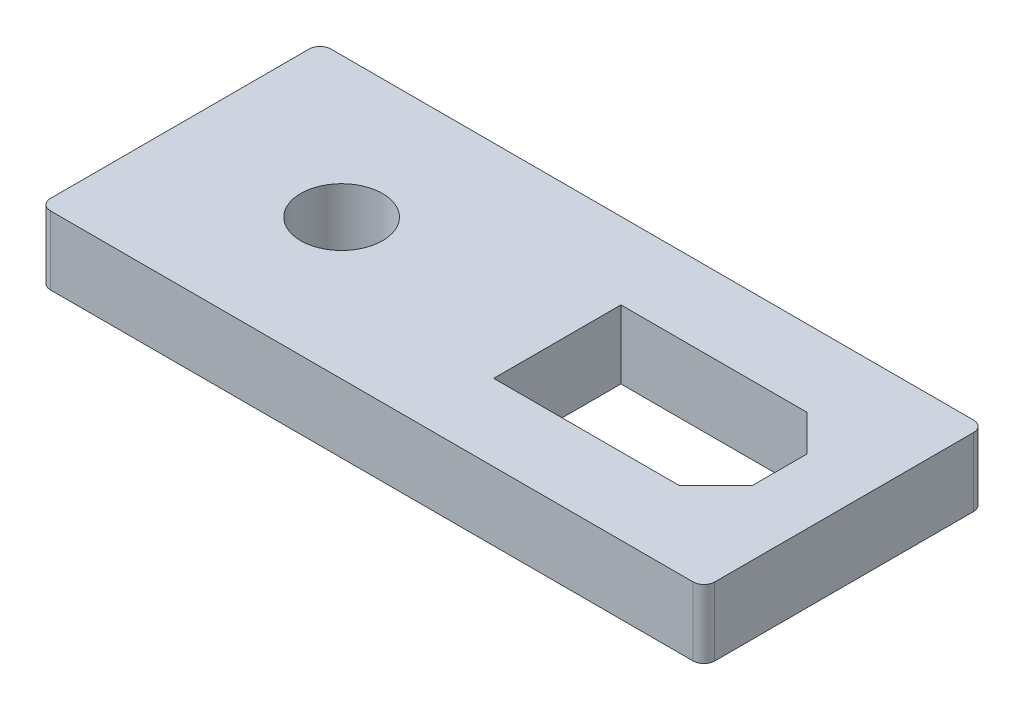
ISO-10303-21;
HEADER;
FILE_DESCRIPTION(('STEP AP214'),'2;1');
FILE_NAME('part.step','',(''),(''),'','','');
FILE_SCHEMA(('AUTOMOTIVE_DESIGN { 1 0 10303 214 1 1 1 1 }'));
ENDSEC;
DATA;
#1=APPLICATION_CONTEXT('core data for automotive mechanical design processes');
#2=APPLICATION_PROTOCOL_DEFINITION('international standard','automotive_design',2000,#1);
#3=PRODUCT_CONTEXT('',#1,'mechanical');
#4=PRODUCT('Part','Part','',(#3));
#5=PRODUCT_RELATED_PRODUCT_CATEGORY('part','',(#4));
#6=PRODUCT_DEFINITION_FORMATION('','',#4);
#7=PRODUCT_DEFINITION_CONTEXT('part definition',#1,'design');
#8=PRODUCT_DEFINITION('design','',#6,#7);
#9=PRODUCT_DEFINITION_SHAPE('','',#8);
#10=(LENGTH_UNIT() NAMED_UNIT(*) SI_UNIT(.MILLI.,.METRE.));
#11=(NAMED_UNIT(*) PLANE_ANGLE_UNIT() SI_UNIT($,.RADIAN.));
#12=(NAMED_UNIT(*) SI_UNIT($,.STERADIAN.) SOLID_ANGLE_UNIT());
#13=UNCERTAINTY_MEASURE_WITH_UNIT(LENGTH_MEASURE(1.E-05),#10,'distance_accuracy_value','');
#14=(GEOMETRIC_REPRESENTATION_CONTEXT(3) GLOBAL_UNCERTAINTY_ASSIGNED_CONTEXT((#13)) GLOBAL_UNIT_ASSIGNED_CONTEXT((#10,
#11,#12)) REPRESENTATION_CONTEXT('',''));
#15=CARTESIAN_POINT('',(0.,0.,0.));
#16=DIRECTION('',(0.,0.,1.));
#17=DIRECTION('',(1.,0.,0.));
#18=AXIS2_PLACEMENT_3D('',#15,#16,#17);
#19=CARTESIAN_POINT('',(0.,3.175,0.));
#20=DIRECTION('',(0.,-1.,0.));
#21=DIRECTION('',(0.,0.,-1.));
#22=AXIS2_PLACEMENT_3D('',#19,#20,#21);
#23=PLANE('',#22);
#24=CARTESIAN_POINT('',(7.5,3.175,-6.5));
#25=DIRECTION('',(0.,1.,0.));
#26=DIRECTION('',(0.,0.,1.));
#27=AXIS2_PLACEMENT_3D('',#24,#25,#26);
#28=CIRCLE('',#27,1.89865);
#29=CARTESIAN_POINT('',(7.5,3.175,-4.60135));
#30=VERTEX_POINT('',#29);
#31=EDGE_CURVE('E218',#30,#30,#28,.T.);
#32=ORIENTED_EDGE('',*,*,#31,.F.);
#33=EDGE_LOOP('',(#32));
#34=FACE_BOUND('',#33,.T.);
#35=DIRECTION('',(0.,0.,-1.));
#36=VECTOR('',#35,1.);
#37=CARTESIAN_POINT('',(30.8,3.175,0.));
#38=LINE('',#37,#36);
#39=CARTESIAN_POINT('',(30.8,3.175,-0.5));
#40=VERTEX_POINT('',#39);
#41=CARTESIAN_POINT('',(30.8,3.175,-12.5));
#42=VERTEX_POINT('',#41);
#43=EDGE_CURVE('E233',#40,#42,#38,.T.);
#44=ORIENTED_EDGE('',*,*,#43,.T.);
#45=CARTESIAN_POINT('',(30.3,3.175,-12.5));
#46=DIRECTION('',(0.,-1.,0.));
#47=DIRECTION('',(0.,0.,-1.));
#48=AXIS2_PLACEMENT_3D('',#45,#46,#47);
#49=CIRCLE('',#48,0.5);
#50=CARTESIAN_POINT('',(30.3,3.175,-13.));
#51=VERTEX_POINT('',#50);
#52=EDGE_CURVE('E288',#42,#51,#49,.F.);
#53=ORIENTED_EDGE('',*,*,#52,.T.);
#54=DIRECTION('',(-1.,0.,0.));
#55=VECTOR('',#54,1.);
#56=CARTESIAN_POINT('',(0.,3.175,-13.));
#57=LINE('',#56,#55);
#58=CARTESIAN_POINT('',(0.5,3.175,-13.));
#59=VERTEX_POINT('',#58);
#60=EDGE_CURVE('E237',#51,#59,#57,.T.);
#61=ORIENTED_EDGE('',*,*,#60,.T.);
#62=CARTESIAN_POINT('',(0.5,3.175,-12.5));
#63=DIRECTION('',(0.,-1.,0.));
#64=DIRECTION('',(0.,0.,-1.));
#65=AXIS2_PLACEMENT_3D('',#62,#63,#64);
#66=CIRCLE('',#65,0.5);
#67=CARTESIAN_POINT('',(0.,3.175,-12.5));
#68=VERTEX_POINT('',#67);
#69=EDGE_CURVE('E282',#59,#68,#66,.F.);
#70=ORIENTED_EDGE('',*,*,#69,.T.);
#71=DIRECTION('',(0.,0.,1.));
#72=VECTOR('',#71,1.);
#73=CARTESIAN_POINT('',(0.,3.175,0.));
#74=LINE('',#73,#72);
#75=CARTESIAN_POINT('',(0.,3.175,-0.5));
#76=VERTEX_POINT('',#75);
#77=EDGE_CURVE('E226',#68,#76,#74,.T.);
#78=ORIENTED_EDGE('',*,*,#77,.T.);
#79=CARTESIAN_POINT('',(0.5,3.175,-0.5));
#80=DIRECTION('',(0.,-1.,0.));
#81=DIRECTION('',(0.,0.,-1.));
#82=AXIS2_PLACEMENT_3D('',#79,#80,#81);
#83=CIRCLE('',#82,0.5);
#84=CARTESIAN_POINT('',(0.5,3.175,0.));
#85=VERTEX_POINT('',#84);
#86=EDGE_CURVE('E62',#76,#85,#83,.F.);
#87=ORIENTED_EDGE('',*,*,#86,.T.);
#88=DIRECTION('',(1.,0.,0.));
#89=VECTOR('',#88,1.);
#90=CARTESIAN_POINT('',(0.,3.175,0.));
#91=LINE('',#90,#89);
#92=CARTESIAN_POINT('',(30.3,3.175,0.));
#93=VERTEX_POINT('',#92);
#94=EDGE_CURVE('E229',#85,#93,#91,.T.);
#95=ORIENTED_EDGE('',*,*,#94,.T.);
#96=CARTESIAN_POINT('',(30.3,3.175,-0.5));
#97=DIRECTION('',(0.,-1.,0.));
#98=DIRECTION('',(0.,0.,-1.));
#99=AXIS2_PLACEMENT_3D('',#96,#97,#98);
#100=CIRCLE('',#99,0.5);
#101=EDGE_CURVE('E285',#93,#40,#100,.F.);
#102=ORIENTED_EDGE('',*,*,#101,.T.);
#103=EDGE_LOOP('',(#44,#53,#61,#70,#78,#87,#95,#102));
#104=FACE_BOUND('',#103,.T.);
#105=DIRECTION('',(0.707106781186551,0.,-0.707106781186543));
#106=VECTOR('',#105,1.);
#107=CARTESIAN_POINT('',(27.8,3.175,-5.22928932188135));
#108=LINE('',#107,#106);
#109=CARTESIAN_POINT('',(26.1207106781186,3.175,-3.55));
#110=VERTEX_POINT('',#109);
#111=CARTESIAN_POINT('',(27.8,3.175,-5.22928932188135));
#112=VERTEX_POINT('',#111);
#113=EDGE_CURVE('E144',#110,#112,#108,.T.);
#114=ORIENTED_EDGE('',*,*,#113,.F.);
#115=DIRECTION('',(1.,0.,0.));
#116=VECTOR('',#115,1.);
#117=CARTESIAN_POINT('',(17.5,3.175,-3.55));
#118=LINE('',#117,#116);
#119=CARTESIAN_POINT('',(17.5,3.175,-3.55));
#120=VERTEX_POINT('',#119);
#121=EDGE_CURVE('E182',#120,#110,#118,.T.);
#122=ORIENTED_EDGE('',*,*,#121,.F.);
#123=DIRECTION('',(0.,0.,1.));
#124=VECTOR('',#123,1.);
#125=CARTESIAN_POINT('',(17.5,3.175,-3.55));
#126=LINE('',#125,#124);
#127=CARTESIAN_POINT('',(17.5,3.175,-9.45));
#128=VERTEX_POINT('',#127);
#129=EDGE_CURVE('E178',#128,#120,#126,.T.);
#130=ORIENTED_EDGE('',*,*,#129,.F.);
#131=DIRECTION('',(-1.,0.,0.));
#132=VECTOR('',#131,1.);
#133=CARTESIAN_POINT('',(17.5,3.175,-9.45));
#134=LINE('',#133,#132);
#135=CARTESIAN_POINT('',(26.1207106781186,3.175,-9.45));
#136=VERTEX_POINT('',#135);
#137=EDGE_CURVE('E173',#136,#128,#134,.T.);
#138=ORIENTED_EDGE('',*,*,#137,.F.);
#139=DIRECTION('',(-0.707106781186552,0.,-0.707106781186543));
#140=VECTOR('',#139,1.);
#141=CARTESIAN_POINT('',(27.8,3.175,-7.77071067811865));
#142=LINE('',#141,#140);
#143=CARTESIAN_POINT('',(27.8,3.175,-7.77071067811865));
#144=VERTEX_POINT('',#143);
#145=EDGE_CURVE('E169',#144,#136,#142,.T.);
#146=ORIENTED_EDGE('',*,*,#145,.F.);
#147=DIRECTION('',(0.,0.,-1.));
#148=VECTOR('',#147,1.);
#149=CARTESIAN_POINT('',(27.8,3.175,-5.22928932188135));
#150=LINE('',#149,#148);
#151=EDGE_CURVE('E155',#112,#144,#150,.T.);
#152=ORIENTED_EDGE('',*,*,#151,.F.);
#153=EDGE_LOOP('',(#114,#122,#130,#138,#146,#152));
#154=FACE_BOUND('',#153,.T.);
#155=ADVANCED_FACE('F39',(#34,#104,#154),#23,.F.);
#156=CARTESIAN_POINT('',(0.,0.,0.));
#157=DIRECTION('',(0.,-1.,0.));
#158=DIRECTION('',(0.,0.,-1.));
#159=AXIS2_PLACEMENT_3D('',#156,#157,#158);
#160=PLANE('',#159);
#161=DIRECTION('',(-1.,0.,0.));
#162=VECTOR('',#161,1.);
#163=CARTESIAN_POINT('',(0.,0.,-13.));
#164=LINE('',#163,#162);
#165=CARTESIAN_POINT('',(30.3,0.,-13.));
#166=VERTEX_POINT('',#165);
#167=CARTESIAN_POINT('',(0.5,0.,-13.));
#168=VERTEX_POINT('',#167);
#169=EDGE_CURVE('E230',#166,#168,#164,.T.);
#170=ORIENTED_EDGE('',*,*,#169,.F.);
#171=CARTESIAN_POINT('',(30.3,0.,-12.5));
#172=DIRECTION('',(0.,-1.,0.));
#173=DIRECTION('',(0.,0.,-1.));
#174=AXIS2_PLACEMENT_3D('',#171,#172,#173);
#175=CIRCLE('',#174,0.5);
#176=CARTESIAN_POINT('',(30.8,0.,-12.5));
#177=VERTEX_POINT('',#176);
#178=EDGE_CURVE('E270',#166,#177,#175,.T.);
#179=ORIENTED_EDGE('',*,*,#178,.T.);
#180=DIRECTION('',(0.,0.,-1.));
#181=VECTOR('',#180,1.);
#182=CARTESIAN_POINT('',(30.8,0.,0.));
#183=LINE('',#182,#181);
#184=CARTESIAN_POINT('',(30.8,0.,-0.5));
#185=VERTEX_POINT('',#184);
#186=EDGE_CURVE('E248',#185,#177,#183,.T.);
#187=ORIENTED_EDGE('',*,*,#186,.F.);
#188=CARTESIAN_POINT('',(30.3,0.,-0.5));
#189=DIRECTION('',(0.,-1.,0.));
#190=DIRECTION('',(0.,0.,-1.));
#191=AXIS2_PLACEMENT_3D('',#188,#189,#190);
#192=CIRCLE('',#191,0.5);
#193=CARTESIAN_POINT('',(30.3,0.,0.));
#194=VERTEX_POINT('',#193);
#195=EDGE_CURVE('E267',#185,#194,#192,.T.);
#196=ORIENTED_EDGE('',*,*,#195,.T.);
#197=DIRECTION('',(1.,0.,0.));
#198=VECTOR('',#197,1.);
#199=CARTESIAN_POINT('',(0.,0.,0.));
#200=LINE('',#199,#198);
#201=CARTESIAN_POINT('',(0.5,0.,0.));
#202=VERTEX_POINT('',#201);
#203=EDGE_CURVE('E245',#202,#194,#200,.T.);
#204=ORIENTED_EDGE('',*,*,#203,.F.);
#205=CARTESIAN_POINT('',(0.5,0.,-0.5));
#206=DIRECTION('',(0.,-1.,0.));
#207=DIRECTION('',(0.,0.,-1.));
#208=AXIS2_PLACEMENT_3D('',#205,#206,#207);
#209=CIRCLE('',#208,0.5);
#210=CARTESIAN_POINT('',(0.,0.,-0.5));
#211=VERTEX_POINT('',#210);
#212=EDGE_CURVE('E261',#202,#211,#209,.T.);
#213=ORIENTED_EDGE('',*,*,#212,.T.);
#214=DIRECTION('',(0.,0.,1.));
#215=VECTOR('',#214,1.);
#216=CARTESIAN_POINT('',(0.,0.,0.));
#217=LINE('',#216,#215);
#218=CARTESIAN_POINT('',(0.,0.,-12.5));
#219=VERTEX_POINT('',#218);
#220=EDGE_CURVE('E222',#219,#211,#217,.T.);
#221=ORIENTED_EDGE('',*,*,#220,.F.);
#222=CARTESIAN_POINT('',(0.5,0.,-12.5));
#223=DIRECTION('',(0.,-1.,0.));
#224=DIRECTION('',(0.,0.,-1.));
#225=AXIS2_PLACEMENT_3D('',#222,#223,#224);
#226=CIRCLE('',#225,0.5);
#227=EDGE_CURVE('E264',#219,#168,#226,.T.);
#228=ORIENTED_EDGE('',*,*,#227,.T.);
#229=EDGE_LOOP('',(#170,#179,#187,#196,#204,#213,#221,#228));
#230=FACE_BOUND('',#229,.T.);
#231=CARTESIAN_POINT('',(7.5,0.,-6.5));
#232=DIRECTION('',(0.,1.,0.));
#233=DIRECTION('',(0.,0.,1.));
#234=AXIS2_PLACEMENT_3D('',#231,#232,#233);
#235=CIRCLE('',#234,1.89865);
#236=CARTESIAN_POINT('',(7.5,0.,-4.60135));
#237=VERTEX_POINT('',#236);
#238=EDGE_CURVE('E164',#237,#237,#235,.T.);
#239=ORIENTED_EDGE('',*,*,#238,.T.);
#240=EDGE_LOOP('',(#239));
#241=FACE_BOUND('',#240,.T.);
#242=DIRECTION('',(1.,0.,0.));
#243=VECTOR('',#242,1.);
#244=CARTESIAN_POINT('',(17.5,0.,-3.55));
#245=LINE('',#244,#243);
#246=CARTESIAN_POINT('',(17.5,0.,-3.55));
#247=VERTEX_POINT('',#246);
#248=CARTESIAN_POINT('',(26.1207106781186,0.,-3.55));
#249=VERTEX_POINT('',#248);
#250=EDGE_CURVE('E156',#247,#249,#245,.T.);
#251=ORIENTED_EDGE('',*,*,#250,.T.);
#252=DIRECTION('',(0.707106781186551,0.,-0.707106781186543));
#253=VECTOR('',#252,1.);
#254=CARTESIAN_POINT('',(27.8,0.,-5.22928932188135));
#255=LINE('',#254,#253);
#256=CARTESIAN_POINT('',(27.8,0.,-5.22928932188135));
#257=VERTEX_POINT('',#256);
#258=EDGE_CURVE('E185',#249,#257,#255,.T.);
#259=ORIENTED_EDGE('',*,*,#258,.T.);
#260=DIRECTION('',(0.,0.,-1.));
#261=VECTOR('',#260,1.);
#262=CARTESIAN_POINT('',(27.8,0.,-5.22928932188135));
#263=LINE('',#262,#261);
#264=CARTESIAN_POINT('',(27.8,0.,-7.77071067811865));
#265=VERTEX_POINT('',#264);
#266=EDGE_CURVE('E162',#257,#265,#263,.T.);
#267=ORIENTED_EDGE('',*,*,#266,.T.);
#268=DIRECTION('',(-0.707106781186552,0.,-0.707106781186543));
#269=VECTOR('',#268,1.);
#270=CARTESIAN_POINT('',(27.8,0.,-7.77071067811865));
#271=LINE('',#270,#269);
#272=CARTESIAN_POINT('',(26.1207106781186,0.,-9.45));
#273=VERTEX_POINT('',#272);
#274=EDGE_CURVE('E190',#265,#273,#271,.T.);
#275=ORIENTED_EDGE('',*,*,#274,.T.);
#276=DIRECTION('',(-1.,0.,0.));
#277=VECTOR('',#276,1.);
#278=CARTESIAN_POINT('',(17.5,0.,-9.45));
#279=LINE('',#278,#277);
#280=CARTESIAN_POINT('',(17.5,0.,-9.45));
#281=VERTEX_POINT('',#280);
#282=EDGE_CURVE('E194',#273,#281,#279,.T.);
#283=ORIENTED_EDGE('',*,*,#282,.T.);
#284=DIRECTION('',(0.,0.,1.));
#285=VECTOR('',#284,1.);
#286=CARTESIAN_POINT('',(17.5,0.,-3.55));
#287=LINE('',#286,#285);
#288=EDGE_CURVE('E198',#281,#247,#287,.T.);
#289=ORIENTED_EDGE('',*,*,#288,.T.);
#290=EDGE_LOOP('',(#251,#259,#267,#275,#283,#289));
#291=FACE_BOUND('',#290,.T.);
#292=ADVANCED_FACE('F310',(#230,#241,#291),#160,.T.);
#293=CARTESIAN_POINT('',(0.,3.175,0.));
#294=DIRECTION('',(1.,0.,0.));
#295=DIRECTION('',(0.,0.,-1.));
#296=AXIS2_PLACEMENT_3D('',#293,#294,#295);
#297=PLANE('',#296);
#298=ORIENTED_EDGE('',*,*,#77,.F.);
#299=DIRECTION('',(0.,-1.,0.));
#300=VECTOR('',#299,1.);
#301=CARTESIAN_POINT('',(0.,3.175,-12.5));
#302=LINE('',#301,#300);
#303=EDGE_CURVE('E11',#68,#219,#302,.T.);
#304=ORIENTED_EDGE('',*,*,#303,.T.);
#305=ORIENTED_EDGE('',*,*,#220,.T.);
#306=DIRECTION('',(0.,-1.,0.));
#307=VECTOR('',#306,1.);
#308=CARTESIAN_POINT('',(0.,3.175,-0.5));
#309=LINE('',#308,#307);
#310=EDGE_CURVE('E48',#211,#76,#309,.F.);
#311=ORIENTED_EDGE('',*,*,#310,.T.);
#312=EDGE_LOOP('',(#298,#304,#305,#311));
#313=FACE_BOUND('',#312,.T.);
#314=ADVANCED_FACE('F300',(#313),#297,.F.);
#315=CARTESIAN_POINT('',(0.,3.175,0.));
#316=DIRECTION('',(0.,0.,-1.));
#317=DIRECTION('',(-1.,0.,0.));
#318=AXIS2_PLACEMENT_3D('',#315,#316,#317);
#319=PLANE('',#318);
#320=ORIENTED_EDGE('',*,*,#203,.T.);
#321=DIRECTION('',(0.,-1.,0.));
#322=VECTOR('',#321,1.);
#323=CARTESIAN_POINT('',(30.3,3.175,0.));
#324=LINE('',#323,#322);
#325=EDGE_CURVE('E55',#194,#93,#324,.F.);
#326=ORIENTED_EDGE('',*,*,#325,.T.);
#327=ORIENTED_EDGE('',*,*,#94,.F.);
#328=DIRECTION('',(0.,-1.,0.));
#329=VECTOR('',#328,1.);
#330=CARTESIAN_POINT('',(0.5,3.175,0.));
#331=LINE('',#330,#329);
#332=EDGE_CURVE('E291',#85,#202,#331,.T.);
#333=ORIENTED_EDGE('',*,*,#332,.T.);
#334=EDGE_LOOP('',(#320,#326,#327,#333));
#335=FACE_BOUND('',#334,.T.);
#336=ADVANCED_FACE('F307',(#335),#319,.F.);
#337=CARTESIAN_POINT('',(30.8,3.175,0.));
#338=DIRECTION('',(-1.,0.,0.));
#339=DIRECTION('',(0.,0.,1.));
#340=AXIS2_PLACEMENT_3D('',#337,#338,#339);
#341=PLANE('',#340);
#342=ORIENTED_EDGE('',*,*,#186,.T.);
#343=DIRECTION('',(0.,-1.,0.));
#344=VECTOR('',#343,1.);
#345=CARTESIAN_POINT('',(30.8,3.175,-12.5));
#346=LINE('',#345,#344);
#347=EDGE_CURVE('E277',#177,#42,#346,.F.);
#348=ORIENTED_EDGE('',*,*,#347,.T.);
#349=ORIENTED_EDGE('',*,*,#43,.F.);
#350=DIRECTION('',(0.,-1.,0.));
#351=VECTOR('',#350,1.);
#352=CARTESIAN_POINT('',(30.8,3.175,-0.5));
#353=LINE('',#352,#351);
#354=EDGE_CURVE('E273',#40,#185,#353,.T.);
#355=ORIENTED_EDGE('',*,*,#354,.T.);
#356=EDGE_LOOP('',(#342,#348,#349,#355));
#357=FACE_BOUND('',#356,.T.);
#358=ADVANCED_FACE('F319',(#357),#341,.F.);
#359=CARTESIAN_POINT('',(0.,3.175,-13.));
#360=DIRECTION('',(0.,0.,1.));
#361=DIRECTION('',(1.,0.,0.));
#362=AXIS2_PLACEMENT_3D('',#359,#360,#361);
#363=PLANE('',#362);
#364=ORIENTED_EDGE('',*,*,#60,.F.);
#365=DIRECTION('',(0.,-1.,0.));
#366=VECTOR('',#365,1.);
#367=CARTESIAN_POINT('',(30.3,3.175,-13.));
#368=LINE('',#367,#366);
#369=EDGE_CURVE('E257',#51,#166,#368,.T.);
#370=ORIENTED_EDGE('',*,*,#369,.T.);
#371=ORIENTED_EDGE('',*,*,#169,.T.);
#372=DIRECTION('',(0.,-1.,0.));
#373=VECTOR('',#372,1.);
#374=CARTESIAN_POINT('',(0.5,3.175,-13.));
#375=LINE('',#374,#373);
#376=EDGE_CURVE('E241',#168,#59,#375,.F.);
#377=ORIENTED_EDGE('',*,*,#376,.T.);
#378=EDGE_LOOP('',(#364,#370,#371,#377));
#379=FACE_BOUND('',#378,.T.);
#380=ADVANCED_FACE('F327',(#379),#363,.F.);
#381=CARTESIAN_POINT('',(7.5,3.175,-6.5));
#382=DIRECTION('',(0.,-1.,0.));
#383=DIRECTION('',(0.,0.,-1.));
#384=AXIS2_PLACEMENT_3D('',#381,#382,#383);
#385=CYLINDRICAL_SURFACE('',#384,1.89865);
#386=ORIENTED_EDGE('',*,*,#31,.T.);
#387=EDGE_LOOP('',(#386));
#388=FACE_BOUND('',#387,.T.);
#389=ORIENTED_EDGE('',*,*,#238,.F.);
#390=EDGE_LOOP('',(#389));
#391=FACE_BOUND('',#390,.T.);
#392=ADVANCED_FACE('F346',(#388,#391),#385,.F.);
#393=CARTESIAN_POINT('',(27.8,3.175,-5.22928932188135));
#394=DIRECTION('',(-0.707106781186544,0.,-0.707106781186551));
#395=DIRECTION('',(-0.707106781186551,0.,0.707106781186544));
#396=AXIS2_PLACEMENT_3D('',#393,#394,#395);
#397=PLANE('',#396);
#398=ORIENTED_EDGE('',*,*,#258,.F.);
#399=DIRECTION('',(0.,-1.,0.));
#400=VECTOR('',#399,1.);
#401=CARTESIAN_POINT('',(26.1207106781186,3.175,-3.55));
#402=LINE('',#401,#400);
#403=EDGE_CURVE('E150',#110,#249,#402,.T.);
#404=ORIENTED_EDGE('',*,*,#403,.F.);
#405=ORIENTED_EDGE('',*,*,#113,.T.);
#406=DIRECTION('',(0.,-1.,0.));
#407=VECTOR('',#406,1.);
#408=CARTESIAN_POINT('',(27.8,3.175,-5.22928932188135));
#409=LINE('',#408,#407);
#410=EDGE_CURVE('E147',#112,#257,#409,.T.);
#411=ORIENTED_EDGE('',*,*,#410,.T.);
#412=EDGE_LOOP('',(#398,#404,#405,#411));
#413=FACE_BOUND('',#412,.T.);
#414=ADVANCED_FACE('F146',(#413),#397,.T.);
#415=CARTESIAN_POINT('',(27.8,3.175,-5.22928932188135));
#416=DIRECTION('',(-1.,0.,0.));
#417=DIRECTION('',(0.,0.,1.));
#418=AXIS2_PLACEMENT_3D('',#415,#416,#417);
#419=PLANE('',#418);
#420=ORIENTED_EDGE('',*,*,#266,.F.);
#421=ORIENTED_EDGE('',*,*,#410,.F.);
#422=ORIENTED_EDGE('',*,*,#151,.T.);
#423=DIRECTION('',(0.,-1.,0.));
#424=VECTOR('',#423,1.);
#425=CARTESIAN_POINT('',(27.8,3.175,-7.77071067811865));
#426=LINE('',#425,#424);
#427=EDGE_CURVE('E165',#144,#265,#426,.T.);
#428=ORIENTED_EDGE('',*,*,#427,.T.);
#429=EDGE_LOOP('',(#420,#421,#422,#428));
#430=FACE_BOUND('',#429,.T.);
#431=ADVANCED_FACE('F159',(#430),#419,.T.);
#432=CARTESIAN_POINT('',(27.8,3.175,-7.77071067811865));
#433=DIRECTION('',(-0.707106781186543,0.,0.707106781186552));
#434=DIRECTION('',(0.707106781186552,0.,0.707106781186543));
#435=AXIS2_PLACEMENT_3D('',#432,#433,#434);
#436=PLANE('',#435);
#437=ORIENTED_EDGE('',*,*,#274,.F.);
#438=ORIENTED_EDGE('',*,*,#427,.F.);
#439=ORIENTED_EDGE('',*,*,#145,.T.);
#440=DIRECTION('',(0.,-1.,0.));
#441=VECTOR('',#440,1.);
#442=CARTESIAN_POINT('',(26.1207106781186,3.175,-9.45));
#443=LINE('',#442,#441);
#444=EDGE_CURVE('E213',#136,#273,#443,.T.);
#445=ORIENTED_EDGE('',*,*,#444,.T.);
#446=EDGE_LOOP('',(#437,#438,#439,#445));
#447=FACE_BOUND('',#446,.T.);
#448=ADVANCED_FACE('F375',(#447),#436,.T.);
#449=CARTESIAN_POINT('',(17.5,3.175,-9.45));
#450=DIRECTION('',(0.,0.,1.));
#451=DIRECTION('',(1.,0.,0.));
#452=AXIS2_PLACEMENT_3D('',#449,#450,#451);
#453=PLANE('',#452);
#454=ORIENTED_EDGE('',*,*,#282,.F.);
#455=ORIENTED_EDGE('',*,*,#444,.F.);
#456=ORIENTED_EDGE('',*,*,#137,.T.);
#457=DIRECTION('',(0.,-1.,0.));
#458=VECTOR('',#457,1.);
#459=CARTESIAN_POINT('',(17.5,3.175,-9.45));
#460=LINE('',#459,#458);
#461=EDGE_CURVE('E210',#128,#281,#460,.T.);
#462=ORIENTED_EDGE('',*,*,#461,.T.);
#463=EDGE_LOOP('',(#454,#455,#456,#462));
#464=FACE_BOUND('',#463,.T.);
#465=ADVANCED_FACE('F368',(#464),#453,.T.);
#466=CARTESIAN_POINT('',(17.5,3.175,-3.55));
#467=DIRECTION('',(1.,0.,0.));
#468=DIRECTION('',(0.,0.,-1.));
#469=AXIS2_PLACEMENT_3D('',#466,#467,#468);
#470=PLANE('',#469);
#471=ORIENTED_EDGE('',*,*,#288,.F.);
#472=ORIENTED_EDGE('',*,*,#461,.F.);
#473=ORIENTED_EDGE('',*,*,#129,.T.);
#474=DIRECTION('',(0.,-1.,0.));
#475=VECTOR('',#474,1.);
#476=CARTESIAN_POINT('',(17.5,3.175,-3.55));
#477=LINE('',#476,#475);
#478=EDGE_CURVE('E207',#120,#247,#477,.T.);
#479=ORIENTED_EDGE('',*,*,#478,.T.);
#480=EDGE_LOOP('',(#471,#472,#473,#479));
#481=FACE_BOUND('',#480,.T.);
#482=ADVANCED_FACE('F362',(#481),#470,.T.);
#483=CARTESIAN_POINT('',(17.5,3.175,-3.55));
#484=DIRECTION('',(0.,0.,-1.));
#485=DIRECTION('',(-1.,0.,0.));
#486=AXIS2_PLACEMENT_3D('',#483,#484,#485);
#487=PLANE('',#486);
#488=ORIENTED_EDGE('',*,*,#250,.F.);
#489=ORIENTED_EDGE('',*,*,#478,.F.);
#490=ORIENTED_EDGE('',*,*,#121,.T.);
#491=ORIENTED_EDGE('',*,*,#403,.T.);
#492=EDGE_LOOP('',(#488,#489,#490,#491));
#493=FACE_BOUND('',#492,.T.);
#494=ADVANCED_FACE('F358',(#493),#487,.T.);
#495=CARTESIAN_POINT('',(30.3,3.175,-12.5));
#496=DIRECTION('',(0.,-1.,0.));
#497=DIRECTION('',(0.,0.,-1.));
#498=AXIS2_PLACEMENT_3D('',#495,#496,#497);
#499=CYLINDRICAL_SURFACE('',#498,0.5);
#500=ORIENTED_EDGE('',*,*,#52,.F.);
#501=ORIENTED_EDGE('',*,*,#347,.F.);
#502=ORIENTED_EDGE('',*,*,#178,.F.);
#503=ORIENTED_EDGE('',*,*,#369,.F.);
#504=EDGE_LOOP('',(#500,#501,#502,#503));
#505=FACE_BOUND('',#504,.T.);
#506=ADVANCED_FACE('F325',(#505),#499,.T.);
#507=CARTESIAN_POINT('',(30.3,3.175,-0.5));
#508=DIRECTION('',(0.,-1.,0.));
#509=DIRECTION('',(0.,0.,-1.));
#510=AXIS2_PLACEMENT_3D('',#507,#508,#509);
#511=CYLINDRICAL_SURFACE('',#510,0.5);
#512=ORIENTED_EDGE('',*,*,#101,.F.);
#513=ORIENTED_EDGE('',*,*,#325,.F.);
#514=ORIENTED_EDGE('',*,*,#195,.F.);
#515=ORIENTED_EDGE('',*,*,#354,.F.);
#516=EDGE_LOOP('',(#512,#513,#514,#515));
#517=FACE_BOUND('',#516,.T.);
#518=ADVANCED_FACE('F316',(#517),#511,.T.);
#519=CARTESIAN_POINT('',(0.5,3.175,-12.5));
#520=DIRECTION('',(0.,-1.,0.));
#521=DIRECTION('',(0.,0.,-1.));
#522=AXIS2_PLACEMENT_3D('',#519,#520,#521);
#523=CYLINDRICAL_SURFACE('',#522,0.5);
#524=ORIENTED_EDGE('',*,*,#69,.F.);
#525=ORIENTED_EDGE('',*,*,#376,.F.);
#526=ORIENTED_EDGE('',*,*,#227,.F.);
#527=ORIENTED_EDGE('',*,*,#303,.F.);
#528=EDGE_LOOP('',(#524,#525,#526,#527));
#529=FACE_BOUND('',#528,.T.);
#530=ADVANCED_FACE('F330',(#529),#523,.T.);
#531=CARTESIAN_POINT('',(0.5,3.175,-0.5));
#532=DIRECTION('',(0.,-1.,0.));
#533=DIRECTION('',(0.,0.,-1.));
#534=AXIS2_PLACEMENT_3D('',#531,#532,#533);
#535=CYLINDRICAL_SURFACE('',#534,0.5);
#536=ORIENTED_EDGE('',*,*,#86,.F.);
#537=ORIENTED_EDGE('',*,*,#310,.F.);
#538=ORIENTED_EDGE('',*,*,#212,.F.);
#539=ORIENTED_EDGE('',*,*,#332,.F.);
#540=EDGE_LOOP('',(#536,#537,#538,#539));
#541=FACE_BOUND('',#540,.T.);
#542=ADVANCED_FACE('F41',(#541),#535,.T.);
#543=CLOSED_SHELL('',(#155,#292,#314,#336,#358,#380,#392,#414,#431,#448,#465,#482,#494,#506,
#518,#530,#542));
#544=MANIFOLD_SOLID_BREP('B2',#543);
#545=ADVANCED_BREP_SHAPE_REPRESENTATION('',(#18,#544),#14);
#546=SHAPE_DEFINITION_REPRESENTATION(#9,#545);
ENDSEC;
END-ISO-10303-21;
